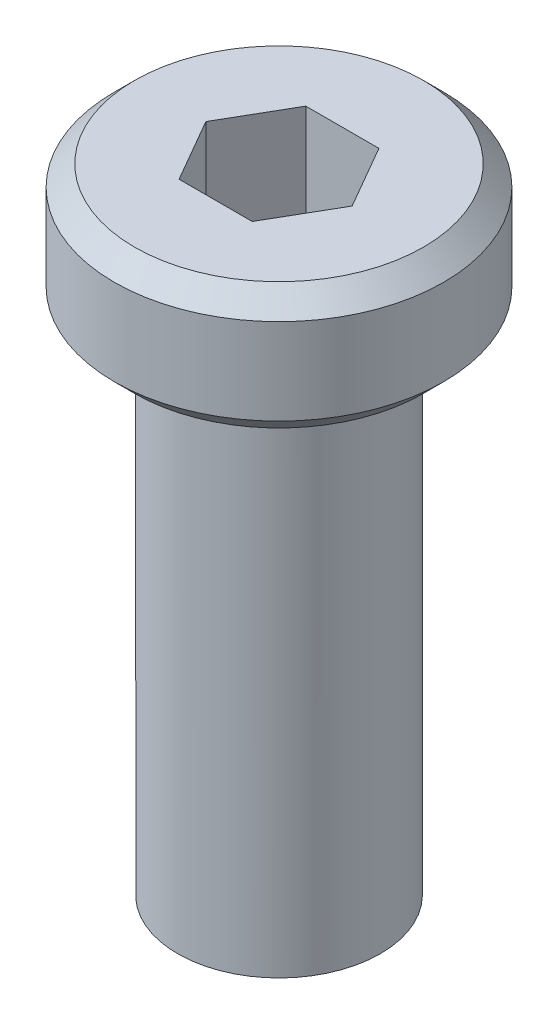
ISO-10303-21;
HEADER;
FILE_DESCRIPTION(('STEP AP214'),'2;1');
FILE_NAME('part.step','',(''),(''),'','','');
FILE_SCHEMA(('AUTOMOTIVE_DESIGN { 1 0 10303 214 1 1 1 1 }'));
ENDSEC;
DATA;
#1=APPLICATION_CONTEXT('core data for automotive mechanical design processes');
#2=APPLICATION_PROTOCOL_DEFINITION('international standard','automotive_design',2000,#1);
#3=PRODUCT_CONTEXT('',#1,'mechanical');
#4=PRODUCT('Part','Part','',(#3));
#5=PRODUCT_RELATED_PRODUCT_CATEGORY('part','',(#4));
#6=PRODUCT_DEFINITION_FORMATION('','',#4);
#7=PRODUCT_DEFINITION_CONTEXT('part definition',#1,'design');
#8=PRODUCT_DEFINITION('design','',#6,#7);
#9=PRODUCT_DEFINITION_SHAPE('','',#8);
#10=(LENGTH_UNIT() NAMED_UNIT(*) SI_UNIT(.MILLI.,.METRE.));
#11=(NAMED_UNIT(*) PLANE_ANGLE_UNIT() SI_UNIT($,.RADIAN.));
#12=(NAMED_UNIT(*) SI_UNIT($,.STERADIAN.) SOLID_ANGLE_UNIT());
#13=UNCERTAINTY_MEASURE_WITH_UNIT(LENGTH_MEASURE(1.E-05),#10,'distance_accuracy_value','');
#14=(GEOMETRIC_REPRESENTATION_CONTEXT(3) GLOBAL_UNCERTAINTY_ASSIGNED_CONTEXT((#13)) GLOBAL_UNIT_ASSIGNED_CONTEXT((#10,
#11,#12)) REPRESENTATION_CONTEXT('',''));
#15=CARTESIAN_POINT('',(0.,0.,0.));
#16=DIRECTION('',(0.,0.,1.));
#17=DIRECTION('',(1.,0.,0.));
#18=AXIS2_PLACEMENT_3D('',#15,#16,#17);
#19=CARTESIAN_POINT('',(-196.686092626193,-235.429596907752,-866.486183378033));
#20=DIRECTION('',(0.,-1.,0.));
#21=DIRECTION('',(1.,0.,0.));
#22=AXIS2_PLACEMENT_3D('',#19,#20,#21);
#23=PLANE('',#22);
#24=DIRECTION('',(-0.5,0.,-0.866025403784439));
#25=VECTOR('',#24,1.);
#26=CARTESIAN_POINT('',(-193.799341280245,-235.429596907752,-866.486183378033));
#27=LINE('',#26,#25);
#28=CARTESIAN_POINT('',(-193.799341280245,-235.429596907752,-866.486183378033));
#29=VERTEX_POINT('',#28);
#30=CARTESIAN_POINT('',(-195.242716953219,-235.429596907752,-868.986183378033));
#31=VERTEX_POINT('',#30);
#32=EDGE_CURVE('E134',#29,#31,#27,.T.);
#33=ORIENTED_EDGE('',*,*,#32,.T.);
#34=DIRECTION('',(-1.,0.,0.));
#35=VECTOR('',#34,1.);
#36=CARTESIAN_POINT('',(-195.242716953219,-235.429596907752,-868.986183378033));
#37=LINE('',#36,#35);
#38=CARTESIAN_POINT('',(-198.129468299167,-235.429596907752,-868.986183378033));
#39=VERTEX_POINT('',#38);
#40=EDGE_CURVE('E139',#31,#39,#37,.T.);
#41=ORIENTED_EDGE('',*,*,#40,.T.);
#42=DIRECTION('',(-0.5,0.,0.866025403784439));
#43=VECTOR('',#42,1.);
#44=CARTESIAN_POINT('',(-198.129468299167,-235.429596907752,-868.986183378033));
#45=LINE('',#44,#43);
#46=CARTESIAN_POINT('',(-199.572843972141,-235.429596907752,-866.486183378033));
#47=VERTEX_POINT('',#46);
#48=EDGE_CURVE('E144',#39,#47,#45,.T.);
#49=ORIENTED_EDGE('',*,*,#48,.T.);
#50=DIRECTION('',(0.5,0.,0.866025403784439));
#51=VECTOR('',#50,1.);
#52=CARTESIAN_POINT('',(-199.572843972141,-235.429596907752,-866.486183378033));
#53=LINE('',#52,#51);
#54=CARTESIAN_POINT('',(-198.129468299166,-235.429596907752,-863.986183378033));
#55=VERTEX_POINT('',#54);
#56=EDGE_CURVE('E90',#47,#55,#53,.T.);
#57=ORIENTED_EDGE('',*,*,#56,.T.);
#58=DIRECTION('',(1.,0.,0.));
#59=VECTOR('',#58,1.);
#60=CARTESIAN_POINT('',(-198.129468299167,-235.429596907752,-863.986183378033));
#61=LINE('',#60,#59);
#62=CARTESIAN_POINT('',(-195.242716953219,-235.429596907752,-863.986183378033));
#63=VERTEX_POINT('',#62);
#64=EDGE_CURVE('E74',#55,#63,#61,.T.);
#65=ORIENTED_EDGE('',*,*,#64,.T.);
#66=DIRECTION('',(0.5,0.,-0.866025403784439));
#67=VECTOR('',#66,1.);
#68=CARTESIAN_POINT('',(-195.242716953219,-235.429596907752,-863.986183378033));
#69=LINE('',#68,#67);
#70=EDGE_CURVE('E79',#63,#29,#69,.T.);
#71=ORIENTED_EDGE('',*,*,#70,.T.);
#72=EDGE_LOOP('',(#33,#41,#49,#57,#65,#71));
#73=FACE_BOUND('',#72,.T.);
#74=ADVANCED_FACE('F17',(#73),#23,.F.);
#75=CARTESIAN_POINT('',(-195.242716953219,-231.629596907752,-863.986183378033));
#76=DIRECTION('',(0.866025403784439,0.,0.5));
#77=DIRECTION('',(0.5,0.,-0.866025403784439));
#78=AXIS2_PLACEMENT_3D('',#75,#76,#77);
#79=PLANE('',#78);
#80=DIRECTION('',(0.,1.,0.));
#81=VECTOR('',#80,1.);
#82=CARTESIAN_POINT('',(-195.242716953219,-231.629596907752,-863.986183378033));
#83=LINE('',#82,#81);
#84=CARTESIAN_POINT('',(-195.242716953219,-231.629596907752,-863.986183378033));
#85=VERTEX_POINT('',#84);
#86=EDGE_CURVE('E81',#63,#85,#83,.T.);
#87=ORIENTED_EDGE('',*,*,#86,.T.);
#88=DIRECTION('',(-0.500000000000103,0.,0.866025403784379));
#89=VECTOR('',#88,1.);
#90=CARTESIAN_POINT('',(-193.799341280244,-231.629596907752,-866.486183378034));
#91=LINE('',#90,#89);
#92=CARTESIAN_POINT('',(-193.799341280245,-231.629596907752,-866.486183378033));
#93=VERTEX_POINT('',#92);
#94=EDGE_CURVE('E132',#93,#85,#91,.T.);
#95=ORIENTED_EDGE('',*,*,#94,.F.);
#96=DIRECTION('',(0.,1.,0.));
#97=VECTOR('',#96,1.);
#98=CARTESIAN_POINT('',(-193.799341280245,-231.629596907752,-866.486183378033));
#99=LINE('',#98,#97);
#100=EDGE_CURVE('E84',#93,#29,#99,.F.);
#101=ORIENTED_EDGE('',*,*,#100,.T.);
#102=ORIENTED_EDGE('',*,*,#70,.F.);
#103=EDGE_LOOP('',(#87,#95,#101,#102));
#104=FACE_BOUND('',#103,.T.);
#105=ADVANCED_FACE('F80',(#104),#79,.F.);
#106=CARTESIAN_POINT('',(-198.129468299167,-231.629596907752,-863.986183378033));
#107=DIRECTION('',(0.,0.,1.));
#108=DIRECTION('',(1.,0.,0.));
#109=AXIS2_PLACEMENT_3D('',#106,#107,#108);
#110=PLANE('',#109);
#111=DIRECTION('',(0.,1.,0.));
#112=VECTOR('',#111,1.);
#113=CARTESIAN_POINT('',(-198.129468299167,-231.629596907752,-863.986183378033));
#114=LINE('',#113,#112);
#115=CARTESIAN_POINT('',(-198.129468299166,-231.629596907752,-863.986183378033));
#116=VERTEX_POINT('',#115);
#117=EDGE_CURVE('E92',#55,#116,#114,.T.);
#118=ORIENTED_EDGE('',*,*,#117,.T.);
#119=DIRECTION('',(-1.,0.,0.));
#120=VECTOR('',#119,1.);
#121=CARTESIAN_POINT('',(-196.686092626193,-231.629596907752,-863.986183378033));
#122=LINE('',#121,#120);
#123=EDGE_CURVE('E96',#85,#116,#122,.T.);
#124=ORIENTED_EDGE('',*,*,#123,.F.);
#125=ORIENTED_EDGE('',*,*,#86,.F.);
#126=ORIENTED_EDGE('',*,*,#64,.F.);
#127=EDGE_LOOP('',(#118,#124,#125,#126));
#128=FACE_BOUND('',#127,.T.);
#129=ADVANCED_FACE('F94',(#128),#110,.F.);
#130=CARTESIAN_POINT('',(-199.572843972141,-231.629596907752,-866.486183378033));
#131=DIRECTION('',(-0.866025403784439,0.,0.5));
#132=DIRECTION('',(0.5,0.,0.866025403784439));
#133=AXIS2_PLACEMENT_3D('',#130,#131,#132);
#134=PLANE('',#133);
#135=DIRECTION('',(0.,1.,0.));
#136=VECTOR('',#135,1.);
#137=CARTESIAN_POINT('',(-199.572843972141,-231.629596907752,-866.486183378033));
#138=LINE('',#137,#136);
#139=CARTESIAN_POINT('',(-199.572843972141,-231.629596907752,-866.486183378034));
#140=VERTEX_POINT('',#139);
#141=EDGE_CURVE('E146',#47,#140,#138,.T.);
#142=ORIENTED_EDGE('',*,*,#141,.T.);
#143=DIRECTION('',(-0.500000000000095,0.,-0.866025403784383));
#144=VECTOR('',#143,1.);
#145=CARTESIAN_POINT('',(-198.129468299166,-231.629596907752,-863.986183378033));
#146=LINE('',#145,#144);
#147=EDGE_CURVE('E128',#116,#140,#146,.T.);
#148=ORIENTED_EDGE('',*,*,#147,.F.);
#149=ORIENTED_EDGE('',*,*,#117,.F.);
#150=ORIENTED_EDGE('',*,*,#56,.F.);
#151=EDGE_LOOP('',(#142,#148,#149,#150));
#152=FACE_BOUND('',#151,.T.);
#153=ADVANCED_FACE('F150',(#152),#134,.F.);
#154=CARTESIAN_POINT('',(-198.129468299167,-231.629596907752,-868.986183378033));
#155=DIRECTION('',(-0.866025403784439,0.,-0.5));
#156=DIRECTION('',(-0.5,0.,0.866025403784439));
#157=AXIS2_PLACEMENT_3D('',#154,#155,#156);
#158=PLANE('',#157);
#159=DIRECTION('',(0.,1.,0.));
#160=VECTOR('',#159,1.);
#161=CARTESIAN_POINT('',(-198.129468299167,-231.629596907752,-868.986183378033));
#162=LINE('',#161,#160);
#163=CARTESIAN_POINT('',(-198.129468299167,-231.629596907752,-868.986183378033));
#164=VERTEX_POINT('',#163);
#165=EDGE_CURVE('E142',#39,#164,#162,.T.);
#166=ORIENTED_EDGE('',*,*,#165,.T.);
#167=DIRECTION('',(0.500000000000119,0.,-0.86602540378437));
#168=VECTOR('',#167,1.);
#169=CARTESIAN_POINT('',(-199.572843972141,-231.629596907752,-866.486183378034));
#170=LINE('',#169,#168);
#171=EDGE_CURVE('E122',#140,#164,#170,.T.);
#172=ORIENTED_EDGE('',*,*,#171,.F.);
#173=ORIENTED_EDGE('',*,*,#141,.F.);
#174=ORIENTED_EDGE('',*,*,#48,.F.);
#175=EDGE_LOOP('',(#166,#172,#173,#174));
#176=FACE_BOUND('',#175,.T.);
#177=ADVANCED_FACE('F163',(#176),#158,.F.);
#178=CARTESIAN_POINT('',(-195.242716953219,-231.629596907752,-868.986183378033));
#179=DIRECTION('',(0.,0.,-1.));
#180=DIRECTION('',(-1.,0.,0.));
#181=AXIS2_PLACEMENT_3D('',#178,#179,#180);
#182=PLANE('',#181);
#183=DIRECTION('',(0.,1.,0.));
#184=VECTOR('',#183,1.);
#185=CARTESIAN_POINT('',(-195.242716953219,-231.629596907752,-868.986183378033));
#186=LINE('',#185,#184);
#187=CARTESIAN_POINT('',(-195.242716953219,-231.629596907752,-868.986183378033));
#188=VERTEX_POINT('',#187);
#189=EDGE_CURVE('E137',#31,#188,#186,.T.);
#190=ORIENTED_EDGE('',*,*,#189,.T.);
#191=DIRECTION('',(-1.,0.,0.));
#192=VECTOR('',#191,1.);
#193=CARTESIAN_POINT('',(-196.686092626193,-231.629596907752,-868.986183378033));
#194=LINE('',#193,#192);
#195=EDGE_CURVE('E117',#164,#188,#194,.F.);
#196=ORIENTED_EDGE('',*,*,#195,.F.);
#197=ORIENTED_EDGE('',*,*,#165,.F.);
#198=ORIENTED_EDGE('',*,*,#40,.F.);
#199=EDGE_LOOP('',(#190,#196,#197,#198));
#200=FACE_BOUND('',#199,.T.);
#201=ADVANCED_FACE('F161',(#200),#182,.F.);
#202=CARTESIAN_POINT('',(-193.799341280245,-231.629596907752,-866.486183378033));
#203=DIRECTION('',(0.866025403784439,0.,-0.5));
#204=DIRECTION('',(-0.5,0.,-0.866025403784439));
#205=AXIS2_PLACEMENT_3D('',#202,#203,#204);
#206=PLANE('',#205);
#207=ORIENTED_EDGE('',*,*,#100,.F.);
#208=DIRECTION('',(0.500000000000386,0.,0.866025403784216));
#209=VECTOR('',#208,1.);
#210=CARTESIAN_POINT('',(-195.242716953219,-231.629596907752,-868.986183378033));
#211=LINE('',#210,#209);
#212=EDGE_CURVE('E111',#188,#93,#211,.T.);
#213=ORIENTED_EDGE('',*,*,#212,.F.);
#214=ORIENTED_EDGE('',*,*,#189,.F.);
#215=ORIENTED_EDGE('',*,*,#32,.F.);
#216=EDGE_LOOP('',(#207,#213,#214,#215));
#217=FACE_BOUND('',#216,.T.);
#218=ADVANCED_FACE('F156',(#217),#206,.F.);
#219=CARTESIAN_POINT('',(-196.686092626193,-231.629596907752,-869.336183378034));
#220=DIRECTION('',(0.,1.,0.));
#221=DIRECTION('',(-1.,0.,0.));
#222=AXIS2_PLACEMENT_3D('',#219,#220,#221);
#223=PLANE('',#222);
#224=ORIENTED_EDGE('',*,*,#195,.T.);
#225=ORIENTED_EDGE('',*,*,#212,.T.);
#226=ORIENTED_EDGE('',*,*,#94,.T.);
#227=ORIENTED_EDGE('',*,*,#123,.T.);
#228=ORIENTED_EDGE('',*,*,#147,.T.);
#229=ORIENTED_EDGE('',*,*,#171,.T.);
#230=EDGE_LOOP('',(#224,#225,#226,#227,#228,#229));
#231=FACE_BOUND('',#230,.T.);
#232=CARTESIAN_POINT('',(-196.686092626193,-231.629596907752,-866.486183378033));
#233=DIRECTION('',(0.,-1.,0.));
#234=DIRECTION('',(0.,0.,-1.));
#235=AXIS2_PLACEMENT_3D('',#232,#233,#234);
#236=CIRCLE('',#235,5.69999999999993);
#237=CARTESIAN_POINT('',(-196.686092626193,-231.629596907752,-872.186183378033));
#238=VERTEX_POINT('',#237);
#239=EDGE_CURVE('E108',#238,#238,#236,.T.);
#240=ORIENTED_EDGE('',*,*,#239,.F.);
#241=EDGE_LOOP('',(#240));
#242=FACE_BOUND('',#241,.T.);
#243=ADVANCED_FACE('F153',(#231,#242),#223,.T.);
#244=CARTESIAN_POINT('',(-196.686092626193,-232.429596907752,-866.486183378033));
#245=DIRECTION('',(0.,-1.,0.));
#246=DIRECTION('',(0.,0.,-1.));
#247=AXIS2_PLACEMENT_3D('',#244,#245,#246);
#248=CONICAL_SURFACE('',#247,6.49999999999995,0.785398163397448);
#249=ORIENTED_EDGE('',*,*,#239,.T.);
#250=EDGE_LOOP('',(#249));
#251=FACE_BOUND('',#250,.T.);
#252=CARTESIAN_POINT('',(-196.686092626193,-232.429596907752,-866.486183378033));
#253=DIRECTION('',(0.,-1.,0.));
#254=DIRECTION('',(1.,0.,0.));
#255=AXIS2_PLACEMENT_3D('',#252,#253,#254);
#256=CIRCLE('',#255,6.49999999999998);
#257=CARTESIAN_POINT('',(-190.186092626193,-232.429596907752,-866.486183378033));
#258=VERTEX_POINT('',#257);
#259=EDGE_CURVE('E110',#258,#258,#256,.T.);
#260=ORIENTED_EDGE('',*,*,#259,.F.);
#261=EDGE_LOOP('',(#260));
#262=FACE_BOUND('',#261,.T.);
#263=ADVANCED_FACE('F232',(#251,#262),#248,.T.);
#264=CARTESIAN_POINT('',(-196.686092626193,-234.129596907752,-866.486183378033));
#265=DIRECTION('',(0.,-1.,0.));
#266=DIRECTION('',(1.,0.,0.));
#267=AXIS2_PLACEMENT_3D('',#264,#265,#266);
#268=CYLINDRICAL_SURFACE('',#267,6.49999999999998);
#269=CARTESIAN_POINT('',(-196.686092626193,-235.829596907752,-866.486183378033));
#270=DIRECTION('',(0.,1.,0.));
#271=DIRECTION('',(0.,0.,-1.));
#272=AXIS2_PLACEMENT_3D('',#269,#270,#271);
#273=CIRCLE('',#272,6.49999999999995);
#274=CARTESIAN_POINT('',(-196.686092626193,-235.829596907752,-872.986183378033));
#275=VERTEX_POINT('',#274);
#276=EDGE_CURVE('E107',#275,#275,#273,.F.);
#277=ORIENTED_EDGE('',*,*,#276,.F.);
#278=EDGE_LOOP('',(#277));
#279=FACE_BOUND('',#278,.T.);
#280=ORIENTED_EDGE('',*,*,#259,.T.);
#281=EDGE_LOOP('',(#280));
#282=FACE_BOUND('',#281,.T.);
#283=ADVANCED_FACE('F229',(#279,#282),#268,.T.);
#284=CARTESIAN_POINT('',(-196.686092626193,-235.829596907752,-866.486183378033));
#285=DIRECTION('',(0.,1.,0.));
#286=DIRECTION('',(0.,0.,1.));
#287=AXIS2_PLACEMENT_3D('',#284,#285,#286);
#288=CONICAL_SURFACE('',#287,6.49999999999995,0.785398163397431);
#289=ORIENTED_EDGE('',*,*,#276,.T.);
#290=EDGE_LOOP('',(#289));
#291=FACE_BOUND('',#290,.T.);
#292=CARTESIAN_POINT('',(-196.686092626193,-236.629596907752,-866.486183378033));
#293=DIRECTION('',(0.,1.,0.));
#294=DIRECTION('',(0.,0.,1.));
#295=AXIS2_PLACEMENT_3D('',#292,#293,#294);
#296=CIRCLE('',#295,5.70000000000004);
#297=CARTESIAN_POINT('',(-196.686092626193,-236.629596907752,-860.786183378033));
#298=VERTEX_POINT('',#297);
#299=EDGE_CURVE('E104',#298,#298,#296,.F.);
#300=ORIENTED_EDGE('',*,*,#299,.F.);
#301=EDGE_LOOP('',(#300));
#302=FACE_BOUND('',#301,.T.);
#303=ADVANCED_FACE('F206',(#291,#302),#288,.T.);
#304=CARTESIAN_POINT('',(-196.686092626193,-236.629596907752,-871.536183378033));
#305=DIRECTION('',(0.,-1.,0.));
#306=DIRECTION('',(1.,0.,0.));
#307=AXIS2_PLACEMENT_3D('',#304,#305,#306);
#308=PLANE('',#307);
#309=CARTESIAN_POINT('',(-196.686092626193,-236.629596907752,-866.486183378033));
#310=DIRECTION('',(0.,-1.,0.));
#311=DIRECTION('',(0.,0.,-1.));
#312=AXIS2_PLACEMENT_3D('',#309,#310,#311);
#313=CIRCLE('',#312,4.40000000000007);
#314=CARTESIAN_POINT('',(-196.686092626193,-236.629596907752,-862.086183378033));
#315=VERTEX_POINT('',#314);
#316=CARTESIAN_POINT('',(-196.686092626193,-236.629596907752,-870.886183378033));
#317=VERTEX_POINT('',#316);
#318=EDGE_CURVE('E36',#315,#317,#313,.F.);
#319=ORIENTED_EDGE('',*,*,#318,.T.);
#320=CARTESIAN_POINT('',(-196.686092626193,-236.629596907752,-866.486183378033));
#321=DIRECTION('',(0.,-1.,0.));
#322=DIRECTION('',(0.,0.,1.));
#323=AXIS2_PLACEMENT_3D('',#320,#321,#322);
#324=CIRCLE('',#323,4.39999999999996);
#325=EDGE_CURVE('E103',#317,#315,#324,.F.);
#326=ORIENTED_EDGE('',*,*,#325,.T.);
#327=EDGE_LOOP('',(#319,#326));
#328=FACE_BOUND('',#327,.T.);
#329=ORIENTED_EDGE('',*,*,#299,.T.);
#330=EDGE_LOOP('',(#329));
#331=FACE_BOUND('',#330,.T.);
#332=ADVANCED_FACE('F197',(#328,#331),#308,.T.);
#333=CARTESIAN_POINT('',(-196.686092626193,-256.629596907753,-868.486183378033));
#334=DIRECTION('',(0.,-1.,0.));
#335=DIRECTION('',(1.,0.,0.));
#336=AXIS2_PLACEMENT_3D('',#333,#334,#335);
#337=PLANE('',#336);
#338=CARTESIAN_POINT('',(-196.686092626193,-256.629596907753,-866.486183378033));
#339=DIRECTION('',(0.,-1.,0.));
#340=DIRECTION('',(1.,0.,0.));
#341=AXIS2_PLACEMENT_3D('',#338,#339,#340);
#342=CIRCLE('',#341,4.);
#343=CARTESIAN_POINT('',(-192.686092626193,-256.629596907753,-866.486183378033));
#344=VERTEX_POINT('',#343);
#345=EDGE_CURVE('E28',#344,#344,#342,.F.);
#346=ORIENTED_EDGE('',*,*,#345,.F.);
#347=EDGE_LOOP('',(#346));
#348=FACE_BOUND('',#347,.T.);
#349=ADVANCED_FACE('F181',(#348),#337,.T.);
#350=CARTESIAN_POINT('',(-196.686092626193,-237.029596907752,-866.486183378033));
#351=DIRECTION('',(0.,1.,0.));
#352=DIRECTION('',(0.,0.,1.));
#353=AXIS2_PLACEMENT_3D('',#350,#351,#352);
#354=TOROIDAL_SURFACE('',#353,4.40000000000007,0.4);
#355=ORIENTED_EDGE('',*,*,#318,.F.);
#356=ORIENTED_EDGE('',*,*,#325,.F.);
#357=EDGE_LOOP('',(#355,#356));
#358=FACE_BOUND('',#357,.T.);
#359=CARTESIAN_POINT('',(-196.686092626193,-237.029596907752,-866.486183378033));
#360=DIRECTION('',(0.,-1.,0.));
#361=DIRECTION('',(1.,0.,0.));
#362=AXIS2_PLACEMENT_3D('',#359,#360,#361);
#363=CIRCLE('',#362,4.);
#364=CARTESIAN_POINT('',(-192.686092626193,-237.029596907752,-866.486183378033));
#365=VERTEX_POINT('',#364);
#366=EDGE_CURVE('E11',#365,#365,#363,.T.);
#367=ORIENTED_EDGE('',*,*,#366,.F.);
#368=EDGE_LOOP('',(#367));
#369=FACE_BOUND('',#368,.T.);
#370=ADVANCED_FACE('F175',(#358,#369),#354,.F.);
#371=CARTESIAN_POINT('',(-196.686092626193,-246.829596907752,-866.486183378033));
#372=DIRECTION('',(0.,-1.,0.));
#373=DIRECTION('',(1.,0.,0.));
#374=AXIS2_PLACEMENT_3D('',#371,#372,#373);
#375=CYLINDRICAL_SURFACE('',#374,4.);
#376=ORIENTED_EDGE('',*,*,#345,.T.);
#377=EDGE_LOOP('',(#376));
#378=FACE_BOUND('',#377,.T.);
#379=ORIENTED_EDGE('',*,*,#366,.T.);
#380=EDGE_LOOP('',(#379));
#381=FACE_BOUND('',#380,.T.);
#382=ADVANCED_FACE('F173',(#378,#381),#375,.T.);
#383=CLOSED_SHELL('',(#74,#105,#129,#153,#177,#201,#218,#243,#263,#283,#303,#332,#349,#370,#382));
#384=MANIFOLD_SOLID_BREP('B1',#383);
#385=ADVANCED_BREP_SHAPE_REPRESENTATION('',(#18,#384),#14);
#386=SHAPE_DEFINITION_REPRESENTATION(#9,#385);
ENDSEC;
END-ISO-10303-21;
